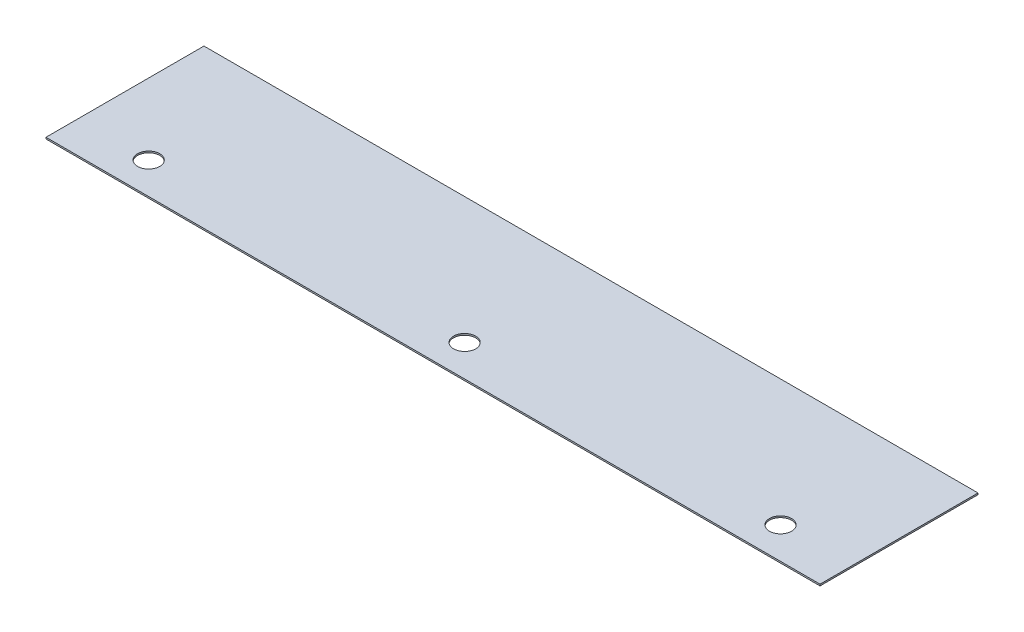
ISO-10303-21;
HEADER;
FILE_DESCRIPTION(('STEP AP214'),'2;1');
FILE_NAME('part.step','',(''),(''),'','','');
FILE_SCHEMA(('AUTOMOTIVE_DESIGN { 1 0 10303 214 1 1 1 1 }'));
ENDSEC;
DATA;
#1=APPLICATION_CONTEXT('core data for automotive mechanical design processes');
#2=APPLICATION_PROTOCOL_DEFINITION('international standard','automotive_design',2000,#1);
#3=PRODUCT_CONTEXT('',#1,'mechanical');
#4=PRODUCT('Part','Part','',(#3));
#5=PRODUCT_RELATED_PRODUCT_CATEGORY('part','',(#4));
#6=PRODUCT_DEFINITION_FORMATION('','',#4);
#7=PRODUCT_DEFINITION_CONTEXT('part definition',#1,'design');
#8=PRODUCT_DEFINITION('design','',#6,#7);
#9=PRODUCT_DEFINITION_SHAPE('','',#8);
#10=(LENGTH_UNIT() NAMED_UNIT(*) SI_UNIT(.MILLI.,.METRE.));
#11=(NAMED_UNIT(*) PLANE_ANGLE_UNIT() SI_UNIT($,.RADIAN.));
#12=(NAMED_UNIT(*) SI_UNIT($,.STERADIAN.) SOLID_ANGLE_UNIT());
#13=UNCERTAINTY_MEASURE_WITH_UNIT(LENGTH_MEASURE(1.E-05),#10,'distance_accuracy_value','');
#14=(GEOMETRIC_REPRESENTATION_CONTEXT(3) GLOBAL_UNCERTAINTY_ASSIGNED_CONTEXT((#13)) GLOBAL_UNIT_ASSIGNED_CONTEXT((#10,
#11,#12)) REPRESENTATION_CONTEXT('',''));
#15=CARTESIAN_POINT('',(0.,0.,0.));
#16=DIRECTION('',(0.,0.,1.));
#17=DIRECTION('',(1.,0.,0.));
#18=AXIS2_PLACEMENT_3D('',#15,#16,#17);
#19=CARTESIAN_POINT('',(122.500000000001,-0.5,24.999999999999));
#20=DIRECTION('',(1.00000000000001,0.,0.));
#21=DIRECTION('',(0.,0.,-1.));
#22=AXIS2_PLACEMENT_3D('',#19,#20,#21);
#23=PLANE('',#22);
#24=DIRECTION('',(0.,0.,-1.));
#25=VECTOR('',#24,1.);
#26=CARTESIAN_POINT('',(122.500000000001,2.4980018054066E-13,24.999999999999));
#27=LINE('',#26,#25);
#28=CARTESIAN_POINT('',(122.500000000001,2.4980018054066E-13,24.999999999999));
#29=VERTEX_POINT('',#28);
#30=CARTESIAN_POINT('',(122.500000000002,2.22044604925031E-13,-25.000000000001));
#31=VERTEX_POINT('',#30);
#32=EDGE_CURVE('E101',#29,#31,#27,.T.);
#33=ORIENTED_EDGE('',*,*,#32,.F.);
#34=DIRECTION('',(0.,1.00000000000001,0.));
#35=VECTOR('',#34,1.);
#36=CARTESIAN_POINT('',(122.500000000001,-0.5,24.999999999999));
#37=LINE('',#36,#35);
#38=CARTESIAN_POINT('',(122.500000000001,-0.5,24.999999999999));
#39=VERTEX_POINT('',#38);
#40=EDGE_CURVE('E11',#39,#29,#37,.T.);
#41=ORIENTED_EDGE('',*,*,#40,.F.);
#42=DIRECTION('',(0.,0.,-1.));
#43=VECTOR('',#42,1.);
#44=CARTESIAN_POINT('',(122.500000000001,-0.5,24.999999999999));
#45=LINE('',#44,#43);
#46=CARTESIAN_POINT('',(122.500000000001,-0.499999999999778,-25.000000000001));
#47=VERTEX_POINT('',#46);
#48=EDGE_CURVE('E94',#39,#47,#45,.T.);
#49=ORIENTED_EDGE('',*,*,#48,.T.);
#50=DIRECTION('',(0.,1.00000000000001,0.));
#51=VECTOR('',#50,1.);
#52=CARTESIAN_POINT('',(122.500000000001,-0.499999999999778,-25.000000000001));
#53=LINE('',#52,#51);
#54=EDGE_CURVE('E39',#47,#31,#53,.T.);
#55=ORIENTED_EDGE('',*,*,#54,.T.);
#56=EDGE_LOOP('',(#33,#41,#49,#55));
#57=FACE_BOUND('',#56,.T.);
#58=ADVANCED_FACE('F36',(#57),#23,.T.);
#59=CARTESIAN_POINT('',(-122.500000000001,-0.499999999999862,25.000000000001));
#60=DIRECTION('',(0.,0.,1.));
#61=DIRECTION('',(1.00000000000001,0.,0.));
#62=AXIS2_PLACEMENT_3D('',#59,#60,#61);
#63=PLANE('',#62);
#64=DIRECTION('',(1.00000000000001,0.,0.));
#65=VECTOR('',#64,1.);
#66=CARTESIAN_POINT('',(-122.500000000001,3.60822483003176E-13,25.000000000001));
#67=LINE('',#66,#65);
#68=CARTESIAN_POINT('',(-122.500000000001,3.60822483003176E-13,25.000000000001));
#69=VERTEX_POINT('',#68);
#70=EDGE_CURVE('E96',#69,#29,#67,.T.);
#71=ORIENTED_EDGE('',*,*,#70,.F.);
#72=DIRECTION('',(0.,1.00000000000001,0.));
#73=VECTOR('',#72,1.);
#74=CARTESIAN_POINT('',(-122.500000000001,-0.499999999999862,25.000000000001));
#75=LINE('',#74,#73);
#76=CARTESIAN_POINT('',(-122.500000000001,-0.499999999999862,25.000000000001));
#77=VERTEX_POINT('',#76);
#78=EDGE_CURVE('E45',#77,#69,#75,.T.);
#79=ORIENTED_EDGE('',*,*,#78,.F.);
#80=DIRECTION('',(1.00000000000001,0.,0.));
#81=VECTOR('',#80,1.);
#82=CARTESIAN_POINT('',(-122.500000000001,-0.499999999999862,25.000000000001));
#83=LINE('',#82,#81);
#84=EDGE_CURVE('E91',#77,#39,#83,.T.);
#85=ORIENTED_EDGE('',*,*,#84,.T.);
#86=ORIENTED_EDGE('',*,*,#40,.T.);
#87=EDGE_LOOP('',(#71,#79,#85,#86));
#88=FACE_BOUND('',#87,.T.);
#89=ADVANCED_FACE('F112',(#88),#63,.T.);
#90=CARTESIAN_POINT('',(-122.500000000001,-0.499999999999862,25.000000000001));
#91=DIRECTION('',(-1.00000000000001,0.,0.));
#92=DIRECTION('',(0.,0.,1.));
#93=AXIS2_PLACEMENT_3D('',#90,#91,#92);
#94=PLANE('',#93);
#95=DIRECTION('',(0.,0.,1.));
#96=VECTOR('',#95,1.);
#97=CARTESIAN_POINT('',(-122.500000000001,3.60822483003176E-13,25.000000000001));
#98=LINE('',#97,#96);
#99=CARTESIAN_POINT('',(-122.500000000001,4.44089209850063E-13,-24.999999999999));
#100=VERTEX_POINT('',#99);
#101=EDGE_CURVE('E86',#100,#69,#98,.T.);
#102=ORIENTED_EDGE('',*,*,#101,.F.);
#103=DIRECTION('',(0.,1.00000000000001,0.));
#104=VECTOR('',#103,1.);
#105=CARTESIAN_POINT('',(-122.500000000001,-0.499999999999778,-24.999999999999));
#106=LINE('',#105,#104);
#107=CARTESIAN_POINT('',(-122.500000000001,-0.499999999999778,-24.999999999999));
#108=VERTEX_POINT('',#107);
#109=EDGE_CURVE('E81',#108,#100,#106,.T.);
#110=ORIENTED_EDGE('',*,*,#109,.F.);
#111=DIRECTION('',(0.,0.,1.));
#112=VECTOR('',#111,1.);
#113=CARTESIAN_POINT('',(-122.500000000001,-0.499999999999862,25.000000000001));
#114=LINE('',#113,#112);
#115=EDGE_CURVE('E84',#108,#77,#114,.T.);
#116=ORIENTED_EDGE('',*,*,#115,.T.);
#117=ORIENTED_EDGE('',*,*,#78,.T.);
#118=EDGE_LOOP('',(#102,#110,#116,#117));
#119=FACE_BOUND('',#118,.T.);
#120=ADVANCED_FACE('F83',(#119),#94,.T.);
#121=CARTESIAN_POINT('',(-122.500000000001,-0.499999999999778,-24.999999999999));
#122=DIRECTION('',(0.,0.,-1.));
#123=DIRECTION('',(-1.00000000000001,0.,0.));
#124=AXIS2_PLACEMENT_3D('',#121,#122,#123);
#125=PLANE('',#124);
#126=DIRECTION('',(-1.00000000000001,0.,0.));
#127=VECTOR('',#126,1.);
#128=CARTESIAN_POINT('',(-122.500000000001,4.44089209850063E-13,-24.999999999999));
#129=LINE('',#128,#127);
#130=EDGE_CURVE('E104',#31,#100,#129,.T.);
#131=ORIENTED_EDGE('',*,*,#130,.F.);
#132=ORIENTED_EDGE('',*,*,#54,.F.);
#133=DIRECTION('',(-1.00000000000001,0.,0.));
#134=VECTOR('',#133,1.);
#135=CARTESIAN_POINT('',(-122.500000000001,-0.499999999999778,-24.999999999999));
#136=LINE('',#135,#134);
#137=EDGE_CURVE('E90',#47,#108,#136,.T.);
#138=ORIENTED_EDGE('',*,*,#137,.T.);
#139=ORIENTED_EDGE('',*,*,#109,.T.);
#140=EDGE_LOOP('',(#131,#132,#138,#139));
#141=FACE_BOUND('',#140,.T.);
#142=ADVANCED_FACE('F93',(#141),#125,.T.);
#143=CARTESIAN_POINT('',(0.,-0.499999999999612,0.));
#144=DIRECTION('',(0.,-1.00000000000001,0.));
#145=DIRECTION('',(0.,0.,-1.));
#146=AXIS2_PLACEMENT_3D('',#143,#144,#145);
#147=PLANE('',#146);
#148=CARTESIAN_POINT('',(-100.000000000001,-0.499999999999612,14.999999999999));
#149=DIRECTION('',(0.,-1.00000000000001,0.));
#150=DIRECTION('',(0.,0.,-1.));
#151=AXIS2_PLACEMENT_3D('',#148,#149,#150);
#152=CIRCLE('',#151,3.5);
#153=CARTESIAN_POINT('',(-100.000000000001,-0.499999999999612,11.499999999999));
#154=VERTEX_POINT('',#153);
#155=EDGE_CURVE('E149',#154,#154,#152,.T.);
#156=ORIENTED_EDGE('',*,*,#155,.F.);
#157=EDGE_LOOP('',(#156));
#158=FACE_BOUND('',#157,.T.);
#159=CARTESIAN_POINT('',(100.000000000001,-0.499999999999834,15.0000000000009));
#160=DIRECTION('',(0.,-1.00000000000001,0.));
#161=DIRECTION('',(0.,0.,-1.));
#162=AXIS2_PLACEMENT_3D('',#159,#160,#161);
#163=CIRCLE('',#162,3.5);
#164=CARTESIAN_POINT('',(100.000000000001,-0.499999999999834,11.5000000000009));
#165=VERTEX_POINT('',#164);
#166=EDGE_CURVE('E160',#165,#165,#163,.T.);
#167=ORIENTED_EDGE('',*,*,#166,.F.);
#168=EDGE_LOOP('',(#167));
#169=FACE_BOUND('',#168,.T.);
#170=CARTESIAN_POINT('',(0.,-0.499999999999862,15.));
#171=DIRECTION('',(0.,-1.00000000000001,0.));
#172=DIRECTION('',(0.,0.,-1.));
#173=AXIS2_PLACEMENT_3D('',#170,#171,#172);
#174=CIRCLE('',#173,3.5);
#175=CARTESIAN_POINT('',(0.,-0.499999999999862,11.5));
#176=VERTEX_POINT('',#175);
#177=EDGE_CURVE('E105',#176,#176,#174,.T.);
#178=ORIENTED_EDGE('',*,*,#177,.F.);
#179=EDGE_LOOP('',(#178));
#180=FACE_BOUND('',#179,.T.);
#181=ORIENTED_EDGE('',*,*,#48,.F.);
#182=ORIENTED_EDGE('',*,*,#84,.F.);
#183=ORIENTED_EDGE('',*,*,#115,.F.);
#184=ORIENTED_EDGE('',*,*,#137,.F.);
#185=EDGE_LOOP('',(#181,#182,#183,#184));
#186=FACE_BOUND('',#185,.T.);
#187=ADVANCED_FACE('F89',(#158,#169,#180,#186),#147,.T.);
#188=CARTESIAN_POINT('',(0.,0.,0.));
#189=DIRECTION('',(0.,-1.00000000000001,0.));
#190=DIRECTION('',(0.,0.,-1.));
#191=AXIS2_PLACEMENT_3D('',#188,#189,#190);
#192=PLANE('',#191);
#193=CARTESIAN_POINT('',(-100.000000000001,4.44089209850063E-13,14.999999999999));
#194=DIRECTION('',(0.,1.00000000000001,0.));
#195=DIRECTION('',(0.,0.,1.));
#196=AXIS2_PLACEMENT_3D('',#193,#194,#195);
#197=CIRCLE('',#196,3.5);
#198=CARTESIAN_POINT('',(-100.000000000001,4.44089209850063E-13,18.499999999999));
#199=VERTEX_POINT('',#198);
#200=EDGE_CURVE('E152',#199,#199,#197,.T.);
#201=ORIENTED_EDGE('',*,*,#200,.F.);
#202=EDGE_LOOP('',(#201));
#203=FACE_BOUND('',#202,.T.);
#204=CARTESIAN_POINT('',(100.000000000001,4.16333634234434E-13,15.0000000000009));
#205=DIRECTION('',(0.,1.00000000000001,0.));
#206=DIRECTION('',(0.,0.,1.));
#207=AXIS2_PLACEMENT_3D('',#204,#205,#206);
#208=CIRCLE('',#207,3.5);
#209=CARTESIAN_POINT('',(100.000000000001,4.16333634234434E-13,18.5000000000009));
#210=VERTEX_POINT('',#209);
#211=EDGE_CURVE('E157',#210,#210,#208,.T.);
#212=ORIENTED_EDGE('',*,*,#211,.F.);
#213=EDGE_LOOP('',(#212));
#214=FACE_BOUND('',#213,.T.);
#215=CARTESIAN_POINT('',(0.,0.,15.));
#216=DIRECTION('',(0.,1.00000000000001,0.));
#217=DIRECTION('',(0.,0.,1.));
#218=AXIS2_PLACEMENT_3D('',#215,#216,#217);
#219=CIRCLE('',#218,3.5);
#220=CARTESIAN_POINT('',(0.,0.,18.5));
#221=VERTEX_POINT('',#220);
#222=EDGE_CURVE('E153',#221,#221,#219,.T.);
#223=ORIENTED_EDGE('',*,*,#222,.F.);
#224=EDGE_LOOP('',(#223));
#225=FACE_BOUND('',#224,.T.);
#226=ORIENTED_EDGE('',*,*,#32,.T.);
#227=ORIENTED_EDGE('',*,*,#130,.T.);
#228=ORIENTED_EDGE('',*,*,#101,.T.);
#229=ORIENTED_EDGE('',*,*,#70,.T.);
#230=EDGE_LOOP('',(#226,#227,#228,#229));
#231=FACE_BOUND('',#230,.T.);
#232=ADVANCED_FACE('F111',(#203,#214,#225,#231),#192,.F.);
#233=CARTESIAN_POINT('',(0.,-9.99999999999973,15.));
#234=DIRECTION('',(0.,1.00000000000001,0.));
#235=DIRECTION('',(0.,0.,1.));
#236=AXIS2_PLACEMENT_3D('',#233,#234,#235);
#237=CYLINDRICAL_SURFACE('',#236,3.5);
#238=ORIENTED_EDGE('',*,*,#177,.T.);
#239=EDGE_LOOP('',(#238));
#240=FACE_BOUND('',#239,.T.);
#241=ORIENTED_EDGE('',*,*,#222,.T.);
#242=EDGE_LOOP('',(#241));
#243=FACE_BOUND('',#242,.T.);
#244=ADVANCED_FACE('F130',(#240,#243),#237,.F.);
#245=CARTESIAN_POINT('',(100.000000000001,-9.9999999999994,15.0000000000002));
#246=DIRECTION('',(0.,1.00000000000001,0.));
#247=DIRECTION('',(0.,0.,1.));
#248=AXIS2_PLACEMENT_3D('',#245,#246,#247);
#249=CYLINDRICAL_SURFACE('',#248,3.5);
#250=ORIENTED_EDGE('',*,*,#166,.T.);
#251=EDGE_LOOP('',(#250));
#252=FACE_BOUND('',#251,.T.);
#253=ORIENTED_EDGE('',*,*,#211,.T.);
#254=EDGE_LOOP('',(#253));
#255=FACE_BOUND('',#254,.T.);
#256=ADVANCED_FACE('F137',(#252,#255),#249,.F.);
#257=CARTESIAN_POINT('',(-100.000000000001,-9.99999999999962,14.9999999999993));
#258=DIRECTION('',(0.,1.00000000000001,0.));
#259=DIRECTION('',(0.,0.,1.));
#260=AXIS2_PLACEMENT_3D('',#257,#258,#259);
#261=CYLINDRICAL_SURFACE('',#260,3.5);
#262=ORIENTED_EDGE('',*,*,#155,.T.);
#263=EDGE_LOOP('',(#262));
#264=FACE_BOUND('',#263,.T.);
#265=ORIENTED_EDGE('',*,*,#200,.T.);
#266=EDGE_LOOP('',(#265));
#267=FACE_BOUND('',#266,.T.);
#268=ADVANCED_FACE('F141',(#264,#267),#261,.F.);
#269=CLOSED_SHELL('',(#58,#89,#120,#142,#187,#232,#244,#256,#268));
#270=MANIFOLD_SOLID_BREP('B2',#269);
#271=ADVANCED_BREP_SHAPE_REPRESENTATION('',(#18,#270),#14);
#272=SHAPE_DEFINITION_REPRESENTATION(#9,#271);
ENDSEC;
END-ISO-10303-21;
